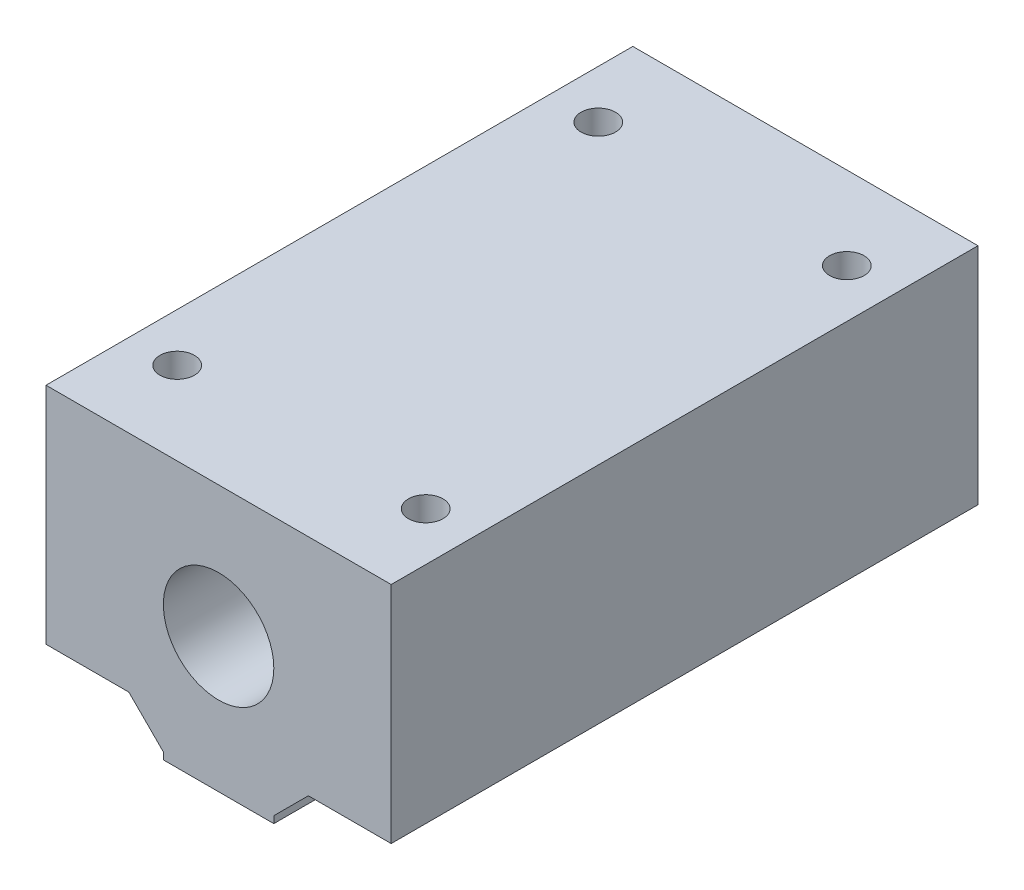
ISO-10303-21;
HEADER;
FILE_DESCRIPTION(('STEP AP214'),'2;1');
FILE_NAME('part.step','',(''),(''),'','','');
FILE_SCHEMA(('AUTOMOTIVE_DESIGN { 1 0 10303 214 1 1 1 1 }'));
ENDSEC;
DATA;
#1=APPLICATION_CONTEXT('core data for automotive mechanical design processes');
#2=APPLICATION_PROTOCOL_DEFINITION('international standard','automotive_design',2000,#1);
#3=PRODUCT_CONTEXT('',#1,'mechanical');
#4=PRODUCT('Part','Part','',(#3));
#5=PRODUCT_RELATED_PRODUCT_CATEGORY('part','',(#4));
#6=PRODUCT_DEFINITION_FORMATION('','',#4);
#7=PRODUCT_DEFINITION_CONTEXT('part definition',#1,'design');
#8=PRODUCT_DEFINITION('design','',#6,#7);
#9=PRODUCT_DEFINITION_SHAPE('','',#8);
#10=(LENGTH_UNIT() NAMED_UNIT(*) SI_UNIT(.MILLI.,.METRE.));
#11=(NAMED_UNIT(*) PLANE_ANGLE_UNIT() SI_UNIT($,.RADIAN.));
#12=(NAMED_UNIT(*) SI_UNIT($,.STERADIAN.) SOLID_ANGLE_UNIT());
#13=UNCERTAINTY_MEASURE_WITH_UNIT(LENGTH_MEASURE(1.E-05),#10,'distance_accuracy_value','');
#14=(GEOMETRIC_REPRESENTATION_CONTEXT(3) GLOBAL_UNCERTAINTY_ASSIGNED_CONTEXT((#13)) GLOBAL_UNIT_ASSIGNED_CONTEXT((#10,
#11,#12)) REPRESENTATION_CONTEXT('',''));
#15=CARTESIAN_POINT('',(0.,0.,0.));
#16=DIRECTION('',(0.,0.,1.));
#17=DIRECTION('',(1.,0.,0.));
#18=AXIS2_PLACEMENT_3D('',#15,#16,#17);
#19=CARTESIAN_POINT('',(-8.,5.99999999999999,85.));
#20=DIRECTION('',(0.,0.,1.));
#21=DIRECTION('',(1.,0.,0.));
#22=AXIS2_PLACEMENT_3D('',#19,#20,#21);
#23=PLANE('',#22);
#24=DIRECTION('',(0.,-1.,0.));
#25=VECTOR('',#24,1.);
#26=CARTESIAN_POINT('',(-8.,0.,85.));
#27=LINE('',#26,#25);
#28=CARTESIAN_POINT('',(-8.,0.999999999999986,85.));
#29=VERTEX_POINT('',#28);
#30=CARTESIAN_POINT('',(-8.,0.,85.));
#31=VERTEX_POINT('',#30);
#32=EDGE_CURVE('E162',#29,#31,#27,.T.);
#33=ORIENTED_EDGE('',*,*,#32,.T.);
#34=DIRECTION('',(1.,0.,0.));
#35=VECTOR('',#34,1.);
#36=CARTESIAN_POINT('',(8.,0.,85.));
#37=LINE('',#36,#35);
#38=CARTESIAN_POINT('',(8.,0.,85.));
#39=VERTEX_POINT('',#38);
#40=EDGE_CURVE('E100',#31,#39,#37,.T.);
#41=ORIENTED_EDGE('',*,*,#40,.T.);
#42=DIRECTION('',(0.,1.,0.));
#43=VECTOR('',#42,1.);
#44=CARTESIAN_POINT('',(8.,0.,85.));
#45=LINE('',#44,#43);
#46=CARTESIAN_POINT('',(8.,0.999999999999986,85.));
#47=VERTEX_POINT('',#46);
#48=EDGE_CURVE('E201',#39,#47,#45,.T.);
#49=ORIENTED_EDGE('',*,*,#48,.T.);
#50=DIRECTION('',(0.707106781186548,0.707106781186547,0.));
#51=VECTOR('',#50,1.);
#52=CARTESIAN_POINT('',(8.,0.999999999999986,85.));
#53=LINE('',#52,#51);
#54=CARTESIAN_POINT('',(13.,5.99999999999999,85.));
#55=VERTEX_POINT('',#54);
#56=EDGE_CURVE('E203',#47,#55,#53,.T.);
#57=ORIENTED_EDGE('',*,*,#56,.T.);
#58=DIRECTION('',(1.,0.,0.));
#59=VECTOR('',#58,1.);
#60=CARTESIAN_POINT('',(13.,5.99999999999999,85.));
#61=LINE('',#60,#59);
#62=CARTESIAN_POINT('',(25.,5.99999999999998,85.));
#63=VERTEX_POINT('',#62);
#64=EDGE_CURVE('E205',#55,#63,#61,.T.);
#65=ORIENTED_EDGE('',*,*,#64,.T.);
#66=DIRECTION('',(0.,1.,0.));
#67=VECTOR('',#66,1.);
#68=CARTESIAN_POINT('',(25.,5.99999999999998,85.));
#69=LINE('',#68,#67);
#70=CARTESIAN_POINT('',(25.,38.5,85.));
#71=VERTEX_POINT('',#70);
#72=EDGE_CURVE('E207',#63,#71,#69,.T.);
#73=ORIENTED_EDGE('',*,*,#72,.T.);
#74=DIRECTION('',(-1.,0.,0.));
#75=VECTOR('',#74,1.);
#76=CARTESIAN_POINT('',(-25.,38.5,85.));
#77=LINE('',#76,#75);
#78=CARTESIAN_POINT('',(-25.,38.5,85.));
#79=VERTEX_POINT('',#78);
#80=EDGE_CURVE('E125',#71,#79,#77,.T.);
#81=ORIENTED_EDGE('',*,*,#80,.T.);
#82=DIRECTION('',(0.,-1.,0.));
#83=VECTOR('',#82,1.);
#84=CARTESIAN_POINT('',(-25.,5.99999999999998,85.));
#85=LINE('',#84,#83);
#86=CARTESIAN_POINT('',(-25.,5.99999999999998,85.));
#87=VERTEX_POINT('',#86);
#88=EDGE_CURVE('E119',#79,#87,#85,.T.);
#89=ORIENTED_EDGE('',*,*,#88,.T.);
#90=DIRECTION('',(1.,0.,0.));
#91=VECTOR('',#90,1.);
#92=CARTESIAN_POINT('',(-13.,5.99999999999999,85.));
#93=LINE('',#92,#91);
#94=CARTESIAN_POINT('',(-13.,5.99999999999999,85.));
#95=VERTEX_POINT('',#94);
#96=EDGE_CURVE('E123',#87,#95,#93,.T.);
#97=ORIENTED_EDGE('',*,*,#96,.T.);
#98=DIRECTION('',(0.707106781186548,-0.707106781186547,0.));
#99=VECTOR('',#98,1.);
#100=CARTESIAN_POINT('',(-8.,0.999999999999986,85.));
#101=LINE('',#100,#99);
#102=EDGE_CURVE('E51',#95,#29,#101,.T.);
#103=ORIENTED_EDGE('',*,*,#102,.T.);
#104=EDGE_LOOP('',(#33,#41,#49,#57,#65,#73,#81,#89,#97,#103));
#105=FACE_BOUND('',#104,.T.);
#106=CARTESIAN_POINT('',(0.,19.5,85.));
#107=DIRECTION('',(0.,0.,1.));
#108=DIRECTION('',(1.,0.,0.));
#109=AXIS2_PLACEMENT_3D('',#106,#107,#108);
#110=CIRCLE('',#109,8.);
#111=CARTESIAN_POINT('',(8.,19.5,85.));
#112=VERTEX_POINT('',#111);
#113=EDGE_CURVE('E147',#112,#112,#110,.T.);
#114=ORIENTED_EDGE('',*,*,#113,.F.);
#115=EDGE_LOOP('',(#114));
#116=FACE_BOUND('',#115,.T.);
#117=ADVANCED_FACE('F32',(#105,#116),#23,.T.);
#118=CARTESIAN_POINT('',(-8.,5.99999999999999,0.));
#119=DIRECTION('',(0.,0.,1.));
#120=DIRECTION('',(1.,0.,0.));
#121=AXIS2_PLACEMENT_3D('',#118,#119,#120);
#122=PLANE('',#121);
#123=DIRECTION('',(0.,-1.,0.));
#124=VECTOR('',#123,1.);
#125=CARTESIAN_POINT('',(-8.,0.,0.));
#126=LINE('',#125,#124);
#127=CARTESIAN_POINT('',(-8.,0.999999999999986,0.));
#128=VERTEX_POINT('',#127);
#129=CARTESIAN_POINT('',(-8.,0.,0.));
#130=VERTEX_POINT('',#129);
#131=EDGE_CURVE('E143',#128,#130,#126,.T.);
#132=ORIENTED_EDGE('',*,*,#131,.F.);
#133=DIRECTION('',(0.707106781186548,-0.707106781186547,0.));
#134=VECTOR('',#133,1.);
#135=CARTESIAN_POINT('',(-8.,0.999999999999986,0.));
#136=LINE('',#135,#134);
#137=CARTESIAN_POINT('',(-13.,5.99999999999999,0.));
#138=VERTEX_POINT('',#137);
#139=EDGE_CURVE('E92',#138,#128,#136,.T.);
#140=ORIENTED_EDGE('',*,*,#139,.F.);
#141=DIRECTION('',(1.,0.,0.));
#142=VECTOR('',#141,1.);
#143=CARTESIAN_POINT('',(-13.,5.99999999999999,0.));
#144=LINE('',#143,#142);
#145=CARTESIAN_POINT('',(-25.,5.99999999999998,0.));
#146=VERTEX_POINT('',#145);
#147=EDGE_CURVE('E86',#146,#138,#144,.T.);
#148=ORIENTED_EDGE('',*,*,#147,.F.);
#149=DIRECTION('',(0.,-1.,0.));
#150=VECTOR('',#149,1.);
#151=CARTESIAN_POINT('',(-25.,5.99999999999998,0.));
#152=LINE('',#151,#150);
#153=CARTESIAN_POINT('',(-25.,38.5,0.));
#154=VERTEX_POINT('',#153);
#155=EDGE_CURVE('E133',#154,#146,#152,.T.);
#156=ORIENTED_EDGE('',*,*,#155,.F.);
#157=DIRECTION('',(-1.,0.,0.));
#158=VECTOR('',#157,1.);
#159=CARTESIAN_POINT('',(-25.,38.5,0.));
#160=LINE('',#159,#158);
#161=CARTESIAN_POINT('',(25.,38.5,0.));
#162=VERTEX_POINT('',#161);
#163=EDGE_CURVE('E157',#162,#154,#160,.T.);
#164=ORIENTED_EDGE('',*,*,#163,.F.);
#165=DIRECTION('',(0.,1.,0.));
#166=VECTOR('',#165,1.);
#167=CARTESIAN_POINT('',(25.,5.99999999999998,0.));
#168=LINE('',#167,#166);
#169=CARTESIAN_POINT('',(25.,5.99999999999998,0.));
#170=VERTEX_POINT('',#169);
#171=EDGE_CURVE('E155',#170,#162,#168,.T.);
#172=ORIENTED_EDGE('',*,*,#171,.F.);
#173=DIRECTION('',(1.,0.,0.));
#174=VECTOR('',#173,1.);
#175=CARTESIAN_POINT('',(13.,5.99999999999999,0.));
#176=LINE('',#175,#174);
#177=CARTESIAN_POINT('',(13.,5.99999999999999,0.));
#178=VERTEX_POINT('',#177);
#179=EDGE_CURVE('E153',#178,#170,#176,.T.);
#180=ORIENTED_EDGE('',*,*,#179,.F.);
#181=DIRECTION('',(0.707106781186548,0.707106781186547,0.));
#182=VECTOR('',#181,1.);
#183=CARTESIAN_POINT('',(8.,0.999999999999986,0.));
#184=LINE('',#183,#182);
#185=CARTESIAN_POINT('',(8.,0.999999999999986,0.));
#186=VERTEX_POINT('',#185);
#187=EDGE_CURVE('E151',#186,#178,#184,.T.);
#188=ORIENTED_EDGE('',*,*,#187,.F.);
#189=DIRECTION('',(0.,1.,0.));
#190=VECTOR('',#189,1.);
#191=CARTESIAN_POINT('',(8.,0.,0.));
#192=LINE('',#191,#190);
#193=CARTESIAN_POINT('',(8.,0.,0.));
#194=VERTEX_POINT('',#193);
#195=EDGE_CURVE('E149',#194,#186,#192,.T.);
#196=ORIENTED_EDGE('',*,*,#195,.F.);
#197=DIRECTION('',(1.,0.,0.));
#198=VECTOR('',#197,1.);
#199=CARTESIAN_POINT('',(8.,0.,0.));
#200=LINE('',#199,#198);
#201=EDGE_CURVE('E146',#130,#194,#200,.T.);
#202=ORIENTED_EDGE('',*,*,#201,.F.);
#203=EDGE_LOOP('',(#132,#140,#148,#156,#164,#172,#180,#188,#196,#202));
#204=FACE_BOUND('',#203,.T.);
#205=CARTESIAN_POINT('',(0.,19.5,0.));
#206=DIRECTION('',(0.,0.,1.));
#207=DIRECTION('',(1.,0.,0.));
#208=AXIS2_PLACEMENT_3D('',#205,#206,#207);
#209=CIRCLE('',#208,8.);
#210=CARTESIAN_POINT('',(8.,19.5,0.));
#211=VERTEX_POINT('',#210);
#212=EDGE_CURVE('E181',#211,#211,#209,.T.);
#213=ORIENTED_EDGE('',*,*,#212,.T.);
#214=EDGE_LOOP('',(#213));
#215=FACE_BOUND('',#214,.T.);
#216=ADVANCED_FACE('F220',(#204,#215),#122,.F.);
#217=CARTESIAN_POINT('',(-8.,0.,85.));
#218=DIRECTION('',(1.,0.,0.));
#219=DIRECTION('',(0.,0.,-1.));
#220=AXIS2_PLACEMENT_3D('',#217,#218,#219);
#221=PLANE('',#220);
#222=ORIENTED_EDGE('',*,*,#131,.T.);
#223=DIRECTION('',(0.,0.,-1.));
#224=VECTOR('',#223,1.);
#225=CARTESIAN_POINT('',(-8.,0.,85.));
#226=LINE('',#225,#224);
#227=EDGE_CURVE('E11',#31,#130,#226,.T.);
#228=ORIENTED_EDGE('',*,*,#227,.F.);
#229=ORIENTED_EDGE('',*,*,#32,.F.);
#230=DIRECTION('',(0.,0.,-1.));
#231=VECTOR('',#230,1.);
#232=CARTESIAN_POINT('',(-8.,0.999999999999986,85.));
#233=LINE('',#232,#231);
#234=EDGE_CURVE('E139',#29,#128,#233,.T.);
#235=ORIENTED_EDGE('',*,*,#234,.T.);
#236=EDGE_LOOP('',(#222,#228,#229,#235));
#237=FACE_BOUND('',#236,.T.);
#238=ADVANCED_FACE('F34',(#237),#221,.F.);
#239=CARTESIAN_POINT('',(8.,0.,85.));
#240=DIRECTION('',(0.,1.,0.));
#241=DIRECTION('',(0.,0.,1.));
#242=AXIS2_PLACEMENT_3D('',#239,#240,#241);
#243=PLANE('',#242);
#244=ORIENTED_EDGE('',*,*,#201,.T.);
#245=DIRECTION('',(0.,0.,-1.));
#246=VECTOR('',#245,1.);
#247=CARTESIAN_POINT('',(8.,0.,85.));
#248=LINE('',#247,#246);
#249=EDGE_CURVE('E42',#39,#194,#248,.T.);
#250=ORIENTED_EDGE('',*,*,#249,.F.);
#251=ORIENTED_EDGE('',*,*,#40,.F.);
#252=ORIENTED_EDGE('',*,*,#227,.T.);
#253=EDGE_LOOP('',(#244,#250,#251,#252));
#254=FACE_BOUND('',#253,.T.);
#255=ADVANCED_FACE('F300',(#254),#243,.F.);
#256=CARTESIAN_POINT('',(8.,0.,85.));
#257=DIRECTION('',(-1.,0.,0.));
#258=DIRECTION('',(0.,0.,1.));
#259=AXIS2_PLACEMENT_3D('',#256,#257,#258);
#260=PLANE('',#259);
#261=ORIENTED_EDGE('',*,*,#195,.T.);
#262=DIRECTION('',(0.,0.,-1.));
#263=VECTOR('',#262,1.);
#264=CARTESIAN_POINT('',(8.,0.999999999999986,85.));
#265=LINE('',#264,#263);
#266=EDGE_CURVE('E175',#47,#186,#265,.T.);
#267=ORIENTED_EDGE('',*,*,#266,.F.);
#268=ORIENTED_EDGE('',*,*,#48,.F.);
#269=ORIENTED_EDGE('',*,*,#249,.T.);
#270=EDGE_LOOP('',(#261,#267,#268,#269));
#271=FACE_BOUND('',#270,.T.);
#272=ADVANCED_FACE('F297',(#271),#260,.F.);
#273=CARTESIAN_POINT('',(8.,0.999999999999986,85.));
#274=DIRECTION('',(-0.707106781186547,0.707106781186548,0.));
#275=DIRECTION('',(-0.707106781186548,-0.707106781186547,0.));
#276=AXIS2_PLACEMENT_3D('',#273,#274,#275);
#277=PLANE('',#276);
#278=ORIENTED_EDGE('',*,*,#187,.T.);
#279=DIRECTION('',(0.,0.,-1.));
#280=VECTOR('',#279,1.);
#281=CARTESIAN_POINT('',(13.,5.99999999999999,85.));
#282=LINE('',#281,#280);
#283=EDGE_CURVE('E172',#55,#178,#282,.T.);
#284=ORIENTED_EDGE('',*,*,#283,.F.);
#285=ORIENTED_EDGE('',*,*,#56,.F.);
#286=ORIENTED_EDGE('',*,*,#266,.T.);
#287=EDGE_LOOP('',(#278,#284,#285,#286));
#288=FACE_BOUND('',#287,.T.);
#289=ADVANCED_FACE('F293',(#288),#277,.F.);
#290=CARTESIAN_POINT('',(13.,5.99999999999999,85.));
#291=DIRECTION('',(0.,1.,0.));
#292=DIRECTION('',(-1.,0.,0.));
#293=AXIS2_PLACEMENT_3D('',#290,#291,#292);
#294=PLANE('',#293);
#295=CARTESIAN_POINT('',(18.,5.99999999999999,73.));
#296=DIRECTION('',(0.,1.,0.));
#297=DIRECTION('',(-1.,0.,0.));
#298=AXIS2_PLACEMENT_3D('',#295,#296,#297);
#299=CIRCLE('',#298,2.5);
#300=CARTESIAN_POINT('',(18.,5.99999999999999,75.5));
#301=VERTEX_POINT('',#300);
#302=EDGE_CURVE('E269',#301,#301,#299,.T.);
#303=ORIENTED_EDGE('',*,*,#302,.T.);
#304=EDGE_LOOP('',(#303));
#305=FACE_BOUND('',#304,.T.);
#306=CARTESIAN_POINT('',(18.,5.99999999999999,12.));
#307=DIRECTION('',(0.,1.,0.));
#308=DIRECTION('',(-1.,0.,0.));
#309=AXIS2_PLACEMENT_3D('',#306,#307,#308);
#310=CIRCLE('',#309,2.5);
#311=CARTESIAN_POINT('',(18.,5.99999999999999,14.5));
#312=VERTEX_POINT('',#311);
#313=EDGE_CURVE('E188',#312,#312,#310,.T.);
#314=ORIENTED_EDGE('',*,*,#313,.T.);
#315=EDGE_LOOP('',(#314));
#316=FACE_BOUND('',#315,.T.);
#317=ORIENTED_EDGE('',*,*,#179,.T.);
#318=DIRECTION('',(0.,0.,-1.));
#319=VECTOR('',#318,1.);
#320=CARTESIAN_POINT('',(25.,5.99999999999998,85.));
#321=LINE('',#320,#319);
#322=EDGE_CURVE('E169',#63,#170,#321,.T.);
#323=ORIENTED_EDGE('',*,*,#322,.F.);
#324=ORIENTED_EDGE('',*,*,#64,.F.);
#325=ORIENTED_EDGE('',*,*,#283,.T.);
#326=EDGE_LOOP('',(#317,#323,#324,#325));
#327=FACE_BOUND('',#326,.T.);
#328=ADVANCED_FACE('F287',(#305,#316,#327),#294,.F.);
#329=CARTESIAN_POINT('',(25.,5.99999999999998,85.));
#330=DIRECTION('',(-1.,0.,0.));
#331=DIRECTION('',(0.,0.,1.));
#332=AXIS2_PLACEMENT_3D('',#329,#330,#331);
#333=PLANE('',#332);
#334=ORIENTED_EDGE('',*,*,#171,.T.);
#335=DIRECTION('',(0.,0.,-1.));
#336=VECTOR('',#335,1.);
#337=CARTESIAN_POINT('',(25.,38.5,85.));
#338=LINE('',#337,#336);
#339=EDGE_CURVE('E166',#71,#162,#338,.T.);
#340=ORIENTED_EDGE('',*,*,#339,.F.);
#341=ORIENTED_EDGE('',*,*,#72,.F.);
#342=ORIENTED_EDGE('',*,*,#322,.T.);
#343=EDGE_LOOP('',(#334,#340,#341,#342));
#344=FACE_BOUND('',#343,.T.);
#345=ADVANCED_FACE('F213',(#344),#333,.F.);
#346=CARTESIAN_POINT('',(-25.,38.5,85.));
#347=DIRECTION('',(0.,-1.,0.));
#348=DIRECTION('',(0.,0.,-1.));
#349=AXIS2_PLACEMENT_3D('',#346,#347,#348);
#350=PLANE('',#349);
#351=CARTESIAN_POINT('',(-18.,38.5,73.));
#352=DIRECTION('',(0.,1.,0.));
#353=DIRECTION('',(0.,0.,-1.));
#354=AXIS2_PLACEMENT_3D('',#351,#352,#353);
#355=CIRCLE('',#354,2.5);
#356=CARTESIAN_POINT('',(-18.,38.5,75.5));
#357=VERTEX_POINT('',#356);
#358=EDGE_CURVE('E264',#357,#357,#355,.T.);
#359=ORIENTED_EDGE('',*,*,#358,.F.);
#360=EDGE_LOOP('',(#359));
#361=FACE_BOUND('',#360,.T.);
#362=CARTESIAN_POINT('',(18.,38.5,73.));
#363=DIRECTION('',(0.,1.,0.));
#364=DIRECTION('',(0.,0.,1.));
#365=AXIS2_PLACEMENT_3D('',#362,#363,#364);
#366=CIRCLE('',#365,2.5);
#367=CARTESIAN_POINT('',(18.,38.5,75.5));
#368=VERTEX_POINT('',#367);
#369=EDGE_CURVE('E267',#368,#368,#366,.T.);
#370=ORIENTED_EDGE('',*,*,#369,.F.);
#371=EDGE_LOOP('',(#370));
#372=FACE_BOUND('',#371,.T.);
#373=CARTESIAN_POINT('',(18.,38.5,12.));
#374=DIRECTION('',(0.,1.,0.));
#375=DIRECTION('',(0.,0.,-1.));
#376=AXIS2_PLACEMENT_3D('',#373,#374,#375);
#377=CIRCLE('',#376,2.5);
#378=CARTESIAN_POINT('',(18.,38.5,14.5));
#379=VERTEX_POINT('',#378);
#380=EDGE_CURVE('E193',#379,#379,#377,.T.);
#381=ORIENTED_EDGE('',*,*,#380,.F.);
#382=EDGE_LOOP('',(#381));
#383=FACE_BOUND('',#382,.T.);
#384=CARTESIAN_POINT('',(-18.,38.5,12.));
#385=DIRECTION('',(0.,1.,0.));
#386=DIRECTION('',(0.,0.,1.));
#387=AXIS2_PLACEMENT_3D('',#384,#385,#386);
#388=CIRCLE('',#387,2.5);
#389=CARTESIAN_POINT('',(-18.,38.5,14.5));
#390=VERTEX_POINT('',#389);
#391=EDGE_CURVE('E182',#390,#390,#388,.T.);
#392=ORIENTED_EDGE('',*,*,#391,.F.);
#393=EDGE_LOOP('',(#392));
#394=FACE_BOUND('',#393,.T.);
#395=ORIENTED_EDGE('',*,*,#163,.T.);
#396=DIRECTION('',(0.,0.,-1.));
#397=VECTOR('',#396,1.);
#398=CARTESIAN_POINT('',(-25.,38.5,85.));
#399=LINE('',#398,#397);
#400=EDGE_CURVE('E134',#79,#154,#399,.T.);
#401=ORIENTED_EDGE('',*,*,#400,.F.);
#402=ORIENTED_EDGE('',*,*,#80,.F.);
#403=ORIENTED_EDGE('',*,*,#339,.T.);
#404=EDGE_LOOP('',(#395,#401,#402,#403));
#405=FACE_BOUND('',#404,.T.);
#406=ADVANCED_FACE('F217',(#361,#372,#383,#394,#405),#350,.F.);
#407=CARTESIAN_POINT('',(-25.,5.99999999999998,85.));
#408=DIRECTION('',(1.,0.,0.));
#409=DIRECTION('',(0.,0.,-1.));
#410=AXIS2_PLACEMENT_3D('',#407,#408,#409);
#411=PLANE('',#410);
#412=ORIENTED_EDGE('',*,*,#155,.T.);
#413=DIRECTION('',(0.,0.,-1.));
#414=VECTOR('',#413,1.);
#415=CARTESIAN_POINT('',(-25.,5.99999999999998,85.));
#416=LINE('',#415,#414);
#417=EDGE_CURVE('E130',#87,#146,#416,.T.);
#418=ORIENTED_EDGE('',*,*,#417,.F.);
#419=ORIENTED_EDGE('',*,*,#88,.F.);
#420=ORIENTED_EDGE('',*,*,#400,.T.);
#421=EDGE_LOOP('',(#412,#418,#419,#420));
#422=FACE_BOUND('',#421,.T.);
#423=ADVANCED_FACE('F131',(#422),#411,.F.);
#424=CARTESIAN_POINT('',(-13.,5.99999999999999,85.));
#425=DIRECTION('',(0.,1.,0.));
#426=DIRECTION('',(-1.,0.,0.));
#427=AXIS2_PLACEMENT_3D('',#424,#425,#426);
#428=PLANE('',#427);
#429=CARTESIAN_POINT('',(-18.,5.99999999999999,73.));
#430=DIRECTION('',(0.,1.,0.));
#431=DIRECTION('',(-1.,0.,0.));
#432=AXIS2_PLACEMENT_3D('',#429,#430,#431);
#433=CIRCLE('',#432,2.5);
#434=CARTESIAN_POINT('',(-18.,5.99999999999999,75.5));
#435=VERTEX_POINT('',#434);
#436=EDGE_CURVE('E36',#435,#435,#433,.T.);
#437=ORIENTED_EDGE('',*,*,#436,.T.);
#438=EDGE_LOOP('',(#437));
#439=FACE_BOUND('',#438,.T.);
#440=CARTESIAN_POINT('',(-18.,5.99999999999999,12.));
#441=DIRECTION('',(0.,1.,0.));
#442=DIRECTION('',(-1.,0.,0.));
#443=AXIS2_PLACEMENT_3D('',#440,#441,#442);
#444=CIRCLE('',#443,2.5);
#445=CARTESIAN_POINT('',(-18.,5.99999999999999,14.5));
#446=VERTEX_POINT('',#445);
#447=EDGE_CURVE('E179',#446,#446,#444,.T.);
#448=ORIENTED_EDGE('',*,*,#447,.T.);
#449=EDGE_LOOP('',(#448));
#450=FACE_BOUND('',#449,.T.);
#451=ORIENTED_EDGE('',*,*,#147,.T.);
#452=DIRECTION('',(0.,0.,-1.));
#453=VECTOR('',#452,1.);
#454=CARTESIAN_POINT('',(-13.,5.99999999999999,85.));
#455=LINE('',#454,#453);
#456=EDGE_CURVE('E135',#95,#138,#455,.T.);
#457=ORIENTED_EDGE('',*,*,#456,.F.);
#458=ORIENTED_EDGE('',*,*,#96,.F.);
#459=ORIENTED_EDGE('',*,*,#417,.T.);
#460=EDGE_LOOP('',(#451,#457,#458,#459));
#461=FACE_BOUND('',#460,.T.);
#462=ADVANCED_FACE('F137',(#439,#450,#461),#428,.F.);
#463=CARTESIAN_POINT('',(-8.,0.999999999999986,85.));
#464=DIRECTION('',(0.707106781186547,0.707106781186548,0.));
#465=DIRECTION('',(-0.707106781186548,0.707106781186547,0.));
#466=AXIS2_PLACEMENT_3D('',#463,#464,#465);
#467=PLANE('',#466);
#468=ORIENTED_EDGE('',*,*,#139,.T.);
#469=ORIENTED_EDGE('',*,*,#234,.F.);
#470=ORIENTED_EDGE('',*,*,#102,.F.);
#471=ORIENTED_EDGE('',*,*,#456,.T.);
#472=EDGE_LOOP('',(#468,#469,#470,#471));
#473=FACE_BOUND('',#472,.T.);
#474=ADVANCED_FACE('F226',(#473),#467,.F.);
#475=CARTESIAN_POINT('',(0.,19.5,85.));
#476=DIRECTION('',(0.,0.,-1.));
#477=DIRECTION('',(-1.,0.,0.));
#478=AXIS2_PLACEMENT_3D('',#475,#476,#477);
#479=CYLINDRICAL_SURFACE('',#478,8.);
#480=ORIENTED_EDGE('',*,*,#113,.T.);
#481=EDGE_LOOP('',(#480));
#482=FACE_BOUND('',#481,.T.);
#483=ORIENTED_EDGE('',*,*,#212,.F.);
#484=EDGE_LOOP('',(#483));
#485=FACE_BOUND('',#484,.T.);
#486=ADVANCED_FACE('F228',(#482,#485),#479,.F.);
#487=CARTESIAN_POINT('',(-18.,0.,12.));
#488=DIRECTION('',(0.,1.,0.));
#489=DIRECTION('',(0.,0.,1.));
#490=AXIS2_PLACEMENT_3D('',#487,#488,#489);
#491=CYLINDRICAL_SURFACE('',#490,2.5);
#492=CARTESIAN_POINT('',(-18.,38.5,14.5));
#493=CARTESIAN_POINT('',(-18.,38.1614583333333,14.5));
#494=CARTESIAN_POINT('',(-18.,37.8229166666666,14.5));
#495=CARTESIAN_POINT('',(-18.,37.1458333333333,14.5));
#496=CARTESIAN_POINT('',(-18.,36.8072916666666,14.5));
#497=CARTESIAN_POINT('',(-18.,36.1302083333333,14.5));
#498=CARTESIAN_POINT('',(-18.,35.7916666666666,14.5));
#499=CARTESIAN_POINT('',(-18.,35.1145833333333,14.5));
#500=CARTESIAN_POINT('',(-18.,34.7760416666666,14.5));
#501=CARTESIAN_POINT('',(-18.,34.0989583333333,14.5));
#502=CARTESIAN_POINT('',(-18.,33.7604166666667,14.5));
#503=CARTESIAN_POINT('',(-18.,33.0833333333333,14.5));
#504=CARTESIAN_POINT('',(-18.,32.7447916666666,14.5));
#505=CARTESIAN_POINT('',(-18.,32.0677083333333,14.5));
#506=CARTESIAN_POINT('',(-18.,31.7291666666666,14.5));
#507=CARTESIAN_POINT('',(-18.,31.0520833333333,14.5));
#508=CARTESIAN_POINT('',(-18.,30.7135416666666,14.5));
#509=CARTESIAN_POINT('',(-18.,30.0364583333333,14.5));
#510=CARTESIAN_POINT('',(-18.,29.6979166666667,14.5));
#511=CARTESIAN_POINT('',(-18.,29.0208333333333,14.5));
#512=CARTESIAN_POINT('',(-18.,28.6822916666667,14.5));
#513=CARTESIAN_POINT('',(-18.,28.0052083333333,14.5));
#514=CARTESIAN_POINT('',(-18.,27.6666666666667,14.5));
#515=CARTESIAN_POINT('',(-18.,26.9895833333333,14.5));
#516=CARTESIAN_POINT('',(-18.,26.6510416666667,14.5));
#517=CARTESIAN_POINT('',(-18.,25.9739583333333,14.5));
#518=CARTESIAN_POINT('',(-18.,25.6354166666667,14.5));
#519=CARTESIAN_POINT('',(-18.,24.9583333333333,14.5));
#520=CARTESIAN_POINT('',(-18.,24.6197916666666,14.5));
#521=CARTESIAN_POINT('',(-18.,23.9427083333333,14.5));
#522=CARTESIAN_POINT('',(-18.,23.6041666666667,14.5));
#523=CARTESIAN_POINT('',(-18.,22.9270833333333,14.5));
#524=CARTESIAN_POINT('',(-18.,22.5885416666667,14.5));
#525=CARTESIAN_POINT('',(-18.,21.9114583333333,14.5));
#526=CARTESIAN_POINT('',(-18.,21.5729166666667,14.5));
#527=CARTESIAN_POINT('',(-18.,20.8958333333333,14.5));
#528=CARTESIAN_POINT('',(-18.,20.5572916666667,14.5));
#529=CARTESIAN_POINT('',(-18.,19.8802083333333,14.5));
#530=CARTESIAN_POINT('',(-18.,19.5416666666666,14.5));
#531=CARTESIAN_POINT('',(-18.,18.8645833333333,14.5));
#532=CARTESIAN_POINT('',(-18.,18.5260416666667,14.5));
#533=CARTESIAN_POINT('',(-18.,17.8489583333333,14.5));
#534=CARTESIAN_POINT('',(-18.,17.5104166666667,14.5));
#535=CARTESIAN_POINT('',(-18.,16.8333333333333,14.5));
#536=CARTESIAN_POINT('',(-18.,16.4947916666666,14.5));
#537=CARTESIAN_POINT('',(-18.,15.8177083333333,14.5));
#538=CARTESIAN_POINT('',(-18.,15.4791666666666,14.5));
#539=CARTESIAN_POINT('',(-18.,14.8020833333333,14.5));
#540=CARTESIAN_POINT('',(-18.,14.4635416666666,14.5));
#541=CARTESIAN_POINT('',(-18.,13.7864583333333,14.5));
#542=CARTESIAN_POINT('',(-18.,13.4479166666667,14.5));
#543=CARTESIAN_POINT('',(-18.,12.7708333333333,14.5));
#544=CARTESIAN_POINT('',(-18.,12.4322916666667,14.5));
#545=CARTESIAN_POINT('',(-18.,11.7552083333333,14.5));
#546=CARTESIAN_POINT('',(-18.,11.4166666666667,14.5));
#547=CARTESIAN_POINT('',(-18.,10.7395833333333,14.5));
#548=CARTESIAN_POINT('',(-18.,10.4010416666666,14.5));
#549=CARTESIAN_POINT('',(-18.,9.72395833333332,14.5));
#550=CARTESIAN_POINT('',(-18.,9.38541666666665,14.5));
#551=CARTESIAN_POINT('',(-18.,8.70833333333332,14.5));
#552=CARTESIAN_POINT('',(-18.,8.36979166666665,14.5));
#553=CARTESIAN_POINT('',(-18.,7.69270833333332,14.5));
#554=CARTESIAN_POINT('',(-18.,7.35416666666665,14.5));
#555=CARTESIAN_POINT('',(-18.,6.67708333333332,14.5));
#556=CARTESIAN_POINT('',(-18.,6.33854166666665,14.5));
#557=CARTESIAN_POINT('',(-18.,5.99999999999998,14.5));
#558=B_SPLINE_CURVE_WITH_KNOTS('',3,(#492,#493,#494,#495,#496,#497,#498,#499,#500,#501,#502,
#503,#504,#505,#506,#507,#508,#509,#510,#511,#512,#513,#514,#515,#516,#517,#518,#519,#520,#521,
#522,#523,#524,#525,#526,#527,#528,#529,#530,#531,#532,#533,#534,#535,#536,#537,#538,#539,#540,
#541,#542,#543,#544,#545,#546,#547,#548,#549,#550,#551,#552,#553,#554,#555,#556,#557),
.UNSPECIFIED.,.F.,.F.,(4,2,2,2,2,2,2,2,2,2,2,2,2,2,2,2,2,2,2,2,2,2,2,2,2,2,2,2,2,2,2,2,4),(0.,
1.015625,2.03125,3.046875,4.0625,5.078125,6.09375,7.109375,8.125,9.140625,10.15625,11.171875,
12.1875,13.203125,14.21875,15.234375,16.25,17.265625,18.28125,19.296875,20.3125,21.328125,
22.34375,23.359375,24.375,25.390625,26.40625,27.421875,28.4375,29.453125,30.46875,31.484375,
32.5),.UNSPECIFIED.);
#559=EDGE_CURVE('BSEAM234',#390,#446,#558,.T.);
#560=ORIENTED_EDGE('',*,*,#391,.T.);
#561=ORIENTED_EDGE('',*,*,#447,.F.);
#562=ORIENTED_EDGE('',*,*,#559,.T.);
#563=ORIENTED_EDGE('',*,*,#559,.F.);
#564=EDGE_LOOP('',(#560,#562,#561,#563));
#565=FACE_BOUND('',#564,.T.);
#566=ADVANCED_FACE('F234',(#565),#491,.F.);
#567=CARTESIAN_POINT('',(18.,0.,12.));
#568=DIRECTION('',(0.,1.,0.));
#569=DIRECTION('',(0.,0.,1.));
#570=AXIS2_PLACEMENT_3D('',#567,#568,#569);
#571=CYLINDRICAL_SURFACE('',#570,2.5);
#572=CARTESIAN_POINT('',(18.,38.5,14.5));
#573=CARTESIAN_POINT('',(18.,38.1614583333333,14.5));
#574=CARTESIAN_POINT('',(18.,37.8229166666666,14.5));
#575=CARTESIAN_POINT('',(18.,37.1458333333333,14.5));
#576=CARTESIAN_POINT('',(18.,36.8072916666666,14.5));
#577=CARTESIAN_POINT('',(18.,36.1302083333333,14.5));
#578=CARTESIAN_POINT('',(18.,35.7916666666666,14.5));
#579=CARTESIAN_POINT('',(18.,35.1145833333333,14.5));
#580=CARTESIAN_POINT('',(18.,34.7760416666666,14.5));
#581=CARTESIAN_POINT('',(18.,34.0989583333333,14.5));
#582=CARTESIAN_POINT('',(18.,33.7604166666667,14.5));
#583=CARTESIAN_POINT('',(18.,33.0833333333333,14.5));
#584=CARTESIAN_POINT('',(18.,32.7447916666666,14.5));
#585=CARTESIAN_POINT('',(18.,32.0677083333333,14.5));
#586=CARTESIAN_POINT('',(18.,31.7291666666666,14.5));
#587=CARTESIAN_POINT('',(18.,31.0520833333333,14.5));
#588=CARTESIAN_POINT('',(18.,30.7135416666666,14.5));
#589=CARTESIAN_POINT('',(18.,30.0364583333333,14.5));
#590=CARTESIAN_POINT('',(18.,29.6979166666667,14.5));
#591=CARTESIAN_POINT('',(18.,29.0208333333333,14.5));
#592=CARTESIAN_POINT('',(18.,28.6822916666667,14.5));
#593=CARTESIAN_POINT('',(18.,28.0052083333333,14.5));
#594=CARTESIAN_POINT('',(18.,27.6666666666667,14.5));
#595=CARTESIAN_POINT('',(18.,26.9895833333333,14.5));
#596=CARTESIAN_POINT('',(18.,26.6510416666667,14.5));
#597=CARTESIAN_POINT('',(18.,25.9739583333333,14.5));
#598=CARTESIAN_POINT('',(18.,25.6354166666667,14.5));
#599=CARTESIAN_POINT('',(18.,24.9583333333333,14.5));
#600=CARTESIAN_POINT('',(18.,24.6197916666666,14.5));
#601=CARTESIAN_POINT('',(18.,23.9427083333333,14.5));
#602=CARTESIAN_POINT('',(18.,23.6041666666667,14.5));
#603=CARTESIAN_POINT('',(18.,22.9270833333333,14.5));
#604=CARTESIAN_POINT('',(18.,22.5885416666667,14.5));
#605=CARTESIAN_POINT('',(18.,21.9114583333333,14.5));
#606=CARTESIAN_POINT('',(18.,21.5729166666667,14.5));
#607=CARTESIAN_POINT('',(18.,20.8958333333333,14.5));
#608=CARTESIAN_POINT('',(18.,20.5572916666667,14.5));
#609=CARTESIAN_POINT('',(18.,19.8802083333333,14.5));
#610=CARTESIAN_POINT('',(18.,19.5416666666666,14.5));
#611=CARTESIAN_POINT('',(18.,18.8645833333333,14.5));
#612=CARTESIAN_POINT('',(18.,18.5260416666667,14.5));
#613=CARTESIAN_POINT('',(18.,17.8489583333333,14.5));
#614=CARTESIAN_POINT('',(18.,17.5104166666667,14.5));
#615=CARTESIAN_POINT('',(18.,16.8333333333333,14.5));
#616=CARTESIAN_POINT('',(18.,16.4947916666666,14.5));
#617=CARTESIAN_POINT('',(18.,15.8177083333333,14.5));
#618=CARTESIAN_POINT('',(18.,15.4791666666666,14.5));
#619=CARTESIAN_POINT('',(18.,14.8020833333333,14.5));
#620=CARTESIAN_POINT('',(18.,14.4635416666666,14.5));
#621=CARTESIAN_POINT('',(18.,13.7864583333333,14.5));
#622=CARTESIAN_POINT('',(18.,13.4479166666667,14.5));
#623=CARTESIAN_POINT('',(18.,12.7708333333333,14.5));
#624=CARTESIAN_POINT('',(18.,12.4322916666667,14.5));
#625=CARTESIAN_POINT('',(18.,11.7552083333333,14.5));
#626=CARTESIAN_POINT('',(18.,11.4166666666667,14.5));
#627=CARTESIAN_POINT('',(18.,10.7395833333333,14.5));
#628=CARTESIAN_POINT('',(18.,10.4010416666666,14.5));
#629=CARTESIAN_POINT('',(18.,9.72395833333332,14.5));
#630=CARTESIAN_POINT('',(18.,9.38541666666665,14.5));
#631=CARTESIAN_POINT('',(18.,8.70833333333332,14.5));
#632=CARTESIAN_POINT('',(18.,8.36979166666665,14.5));
#633=CARTESIAN_POINT('',(18.,7.69270833333332,14.5));
#634=CARTESIAN_POINT('',(18.,7.35416666666665,14.5));
#635=CARTESIAN_POINT('',(18.,6.67708333333332,14.5));
#636=CARTESIAN_POINT('',(18.,6.33854166666665,14.5));
#637=CARTESIAN_POINT('',(18.,5.99999999999998,14.5));
#638=B_SPLINE_CURVE_WITH_KNOTS('',3,(#572,#573,#574,#575,#576,#577,#578,#579,#580,#581,#582,
#583,#584,#585,#586,#587,#588,#589,#590,#591,#592,#593,#594,#595,#596,#597,#598,#599,#600,#601,
#602,#603,#604,#605,#606,#607,#608,#609,#610,#611,#612,#613,#614,#615,#616,#617,#618,#619,#620,
#621,#622,#623,#624,#625,#626,#627,#628,#629,#630,#631,#632,#633,#634,#635,#636,#637),
.UNSPECIFIED.,.F.,.F.,(4,2,2,2,2,2,2,2,2,2,2,2,2,2,2,2,2,2,2,2,2,2,2,2,2,2,2,2,2,2,2,2,4),(0.,
1.015625,2.03125,3.046875,4.0625,5.078125,6.09375,7.109375,8.125,9.140625,10.15625,11.171875,
12.1875,13.203125,14.21875,15.234375,16.25,17.265625,18.28125,19.296875,20.3125,21.328125,
22.34375,23.359375,24.375,25.390625,26.40625,27.421875,28.4375,29.453125,30.46875,31.484375,
32.5),.UNSPECIFIED.);
#639=EDGE_CURVE('BSEAM248',#379,#312,#638,.T.);
#640=ORIENTED_EDGE('',*,*,#380,.T.);
#641=ORIENTED_EDGE('',*,*,#313,.F.);
#642=ORIENTED_EDGE('',*,*,#639,.T.);
#643=ORIENTED_EDGE('',*,*,#639,.F.);
#644=EDGE_LOOP('',(#640,#642,#641,#643));
#645=FACE_BOUND('',#644,.T.);
#646=ADVANCED_FACE('F248',(#645),#571,.F.);
#647=CARTESIAN_POINT('',(18.,0.,73.));
#648=DIRECTION('',(0.,1.,0.));
#649=DIRECTION('',(0.,0.,1.));
#650=AXIS2_PLACEMENT_3D('',#647,#648,#649);
#651=CYLINDRICAL_SURFACE('',#650,2.5);
#652=CARTESIAN_POINT('',(18.,38.5,75.5));
#653=CARTESIAN_POINT('',(18.,38.1614583333333,75.5));
#654=CARTESIAN_POINT('',(18.,37.8229166666666,75.5));
#655=CARTESIAN_POINT('',(18.,37.1458333333333,75.5));
#656=CARTESIAN_POINT('',(18.,36.8072916666666,75.5));
#657=CARTESIAN_POINT('',(18.,36.1302083333333,75.5));
#658=CARTESIAN_POINT('',(18.,35.7916666666666,75.5));
#659=CARTESIAN_POINT('',(18.,35.1145833333333,75.5));
#660=CARTESIAN_POINT('',(18.,34.7760416666666,75.5));
#661=CARTESIAN_POINT('',(18.,34.0989583333333,75.5));
#662=CARTESIAN_POINT('',(18.,33.7604166666667,75.5));
#663=CARTESIAN_POINT('',(18.,33.0833333333333,75.5));
#664=CARTESIAN_POINT('',(18.,32.7447916666666,75.5));
#665=CARTESIAN_POINT('',(18.,32.0677083333333,75.5));
#666=CARTESIAN_POINT('',(18.,31.7291666666666,75.5));
#667=CARTESIAN_POINT('',(18.,31.0520833333333,75.5));
#668=CARTESIAN_POINT('',(18.,30.7135416666666,75.5));
#669=CARTESIAN_POINT('',(18.,30.0364583333333,75.5));
#670=CARTESIAN_POINT('',(18.,29.6979166666667,75.5));
#671=CARTESIAN_POINT('',(18.,29.0208333333333,75.5));
#672=CARTESIAN_POINT('',(18.,28.6822916666667,75.5));
#673=CARTESIAN_POINT('',(18.,28.0052083333333,75.5));
#674=CARTESIAN_POINT('',(18.,27.6666666666667,75.5));
#675=CARTESIAN_POINT('',(18.,26.9895833333333,75.5));
#676=CARTESIAN_POINT('',(18.,26.6510416666667,75.5));
#677=CARTESIAN_POINT('',(18.,25.9739583333333,75.5));
#678=CARTESIAN_POINT('',(18.,25.6354166666667,75.5));
#679=CARTESIAN_POINT('',(18.,24.9583333333333,75.5));
#680=CARTESIAN_POINT('',(18.,24.6197916666666,75.5));
#681=CARTESIAN_POINT('',(18.,23.9427083333333,75.5));
#682=CARTESIAN_POINT('',(18.,23.6041666666667,75.5));
#683=CARTESIAN_POINT('',(18.,22.9270833333333,75.5));
#684=CARTESIAN_POINT('',(18.,22.5885416666667,75.5));
#685=CARTESIAN_POINT('',(18.,21.9114583333333,75.5));
#686=CARTESIAN_POINT('',(18.,21.5729166666667,75.5));
#687=CARTESIAN_POINT('',(18.,20.8958333333333,75.5));
#688=CARTESIAN_POINT('',(18.,20.5572916666667,75.5));
#689=CARTESIAN_POINT('',(18.,19.8802083333333,75.5));
#690=CARTESIAN_POINT('',(18.,19.5416666666666,75.5));
#691=CARTESIAN_POINT('',(18.,18.8645833333333,75.5));
#692=CARTESIAN_POINT('',(18.,18.5260416666667,75.5));
#693=CARTESIAN_POINT('',(18.,17.8489583333333,75.5));
#694=CARTESIAN_POINT('',(18.,17.5104166666667,75.5));
#695=CARTESIAN_POINT('',(18.,16.8333333333333,75.5));
#696=CARTESIAN_POINT('',(18.,16.4947916666666,75.5));
#697=CARTESIAN_POINT('',(18.,15.8177083333333,75.5));
#698=CARTESIAN_POINT('',(18.,15.4791666666666,75.5));
#699=CARTESIAN_POINT('',(18.,14.8020833333333,75.5));
#700=CARTESIAN_POINT('',(18.,14.4635416666666,75.5));
#701=CARTESIAN_POINT('',(18.,13.7864583333333,75.5));
#702=CARTESIAN_POINT('',(18.,13.4479166666667,75.5));
#703=CARTESIAN_POINT('',(18.,12.7708333333333,75.5));
#704=CARTESIAN_POINT('',(18.,12.4322916666667,75.5));
#705=CARTESIAN_POINT('',(18.,11.7552083333333,75.5));
#706=CARTESIAN_POINT('',(18.,11.4166666666667,75.5));
#707=CARTESIAN_POINT('',(18.,10.7395833333333,75.5));
#708=CARTESIAN_POINT('',(18.,10.4010416666666,75.5));
#709=CARTESIAN_POINT('',(18.,9.72395833333332,75.5));
#710=CARTESIAN_POINT('',(18.,9.38541666666665,75.5));
#711=CARTESIAN_POINT('',(18.,8.70833333333332,75.5));
#712=CARTESIAN_POINT('',(18.,8.36979166666665,75.5));
#713=CARTESIAN_POINT('',(18.,7.69270833333332,75.5));
#714=CARTESIAN_POINT('',(18.,7.35416666666665,75.5));
#715=CARTESIAN_POINT('',(18.,6.67708333333332,75.5));
#716=CARTESIAN_POINT('',(18.,6.33854166666665,75.5));
#717=CARTESIAN_POINT('',(18.,5.99999999999998,75.5));
#718=B_SPLINE_CURVE_WITH_KNOTS('',3,(#652,#653,#654,#655,#656,#657,#658,#659,#660,#661,#662,
#663,#664,#665,#666,#667,#668,#669,#670,#671,#672,#673,#674,#675,#676,#677,#678,#679,#680,#681,
#682,#683,#684,#685,#686,#687,#688,#689,#690,#691,#692,#693,#694,#695,#696,#697,#698,#699,#700,
#701,#702,#703,#704,#705,#706,#707,#708,#709,#710,#711,#712,#713,#714,#715,#716,#717),
.UNSPECIFIED.,.F.,.F.,(4,2,2,2,2,2,2,2,2,2,2,2,2,2,2,2,2,2,2,2,2,2,2,2,2,2,2,2,2,2,2,2,4),(0.,
1.015625,2.03125,3.046875,4.0625,5.078125,6.09375,7.109375,8.125,9.140625,10.15625,11.171875,
12.1875,13.203125,14.21875,15.234375,16.25,17.265625,18.28125,19.296875,20.3125,21.328125,
22.34375,23.359375,24.375,25.390625,26.40625,27.421875,28.4375,29.453125,30.46875,31.484375,
32.5),.UNSPECIFIED.);
#719=EDGE_CURVE('BSEAM251',#368,#301,#718,.T.);
#720=ORIENTED_EDGE('',*,*,#369,.T.);
#721=ORIENTED_EDGE('',*,*,#302,.F.);
#722=ORIENTED_EDGE('',*,*,#719,.T.);
#723=ORIENTED_EDGE('',*,*,#719,.F.);
#724=EDGE_LOOP('',(#720,#722,#721,#723));
#725=FACE_BOUND('',#724,.T.);
#726=ADVANCED_FACE('F251',(#725),#651,.F.);
#727=CARTESIAN_POINT('',(-18.,0.,73.));
#728=DIRECTION('',(0.,1.,0.));
#729=DIRECTION('',(0.,0.,1.));
#730=AXIS2_PLACEMENT_3D('',#727,#728,#729);
#731=CYLINDRICAL_SURFACE('',#730,2.5);
#732=CARTESIAN_POINT('',(-18.,38.5,75.5));
#733=CARTESIAN_POINT('',(-18.,38.1614583333333,75.5));
#734=CARTESIAN_POINT('',(-18.,37.8229166666666,75.5));
#735=CARTESIAN_POINT('',(-18.,37.1458333333333,75.5));
#736=CARTESIAN_POINT('',(-18.,36.8072916666666,75.5));
#737=CARTESIAN_POINT('',(-18.,36.1302083333333,75.5));
#738=CARTESIAN_POINT('',(-18.,35.7916666666666,75.5));
#739=CARTESIAN_POINT('',(-18.,35.1145833333333,75.5));
#740=CARTESIAN_POINT('',(-18.,34.7760416666666,75.5));
#741=CARTESIAN_POINT('',(-18.,34.0989583333333,75.5));
#742=CARTESIAN_POINT('',(-18.,33.7604166666667,75.5));
#743=CARTESIAN_POINT('',(-18.,33.0833333333333,75.5));
#744=CARTESIAN_POINT('',(-18.,32.7447916666666,75.5));
#745=CARTESIAN_POINT('',(-18.,32.0677083333333,75.5));
#746=CARTESIAN_POINT('',(-18.,31.7291666666666,75.5));
#747=CARTESIAN_POINT('',(-18.,31.0520833333333,75.5));
#748=CARTESIAN_POINT('',(-18.,30.7135416666666,75.5));
#749=CARTESIAN_POINT('',(-18.,30.0364583333333,75.5));
#750=CARTESIAN_POINT('',(-18.,29.6979166666667,75.5));
#751=CARTESIAN_POINT('',(-18.,29.0208333333333,75.5));
#752=CARTESIAN_POINT('',(-18.,28.6822916666667,75.5));
#753=CARTESIAN_POINT('',(-18.,28.0052083333333,75.5));
#754=CARTESIAN_POINT('',(-18.,27.6666666666667,75.5));
#755=CARTESIAN_POINT('',(-18.,26.9895833333333,75.5));
#756=CARTESIAN_POINT('',(-18.,26.6510416666667,75.5));
#757=CARTESIAN_POINT('',(-18.,25.9739583333333,75.5));
#758=CARTESIAN_POINT('',(-18.,25.6354166666667,75.5));
#759=CARTESIAN_POINT('',(-18.,24.9583333333333,75.5));
#760=CARTESIAN_POINT('',(-18.,24.6197916666666,75.5));
#761=CARTESIAN_POINT('',(-18.,23.9427083333333,75.5));
#762=CARTESIAN_POINT('',(-18.,23.6041666666667,75.5));
#763=CARTESIAN_POINT('',(-18.,22.9270833333333,75.5));
#764=CARTESIAN_POINT('',(-18.,22.5885416666667,75.5));
#765=CARTESIAN_POINT('',(-18.,21.9114583333333,75.5));
#766=CARTESIAN_POINT('',(-18.,21.5729166666667,75.5));
#767=CARTESIAN_POINT('',(-18.,20.8958333333333,75.5));
#768=CARTESIAN_POINT('',(-18.,20.5572916666667,75.5));
#769=CARTESIAN_POINT('',(-18.,19.8802083333333,75.5));
#770=CARTESIAN_POINT('',(-18.,19.5416666666666,75.5));
#771=CARTESIAN_POINT('',(-18.,18.8645833333333,75.5));
#772=CARTESIAN_POINT('',(-18.,18.5260416666667,75.5));
#773=CARTESIAN_POINT('',(-18.,17.8489583333333,75.5));
#774=CARTESIAN_POINT('',(-18.,17.5104166666667,75.5));
#775=CARTESIAN_POINT('',(-18.,16.8333333333333,75.5));
#776=CARTESIAN_POINT('',(-18.,16.4947916666666,75.5));
#777=CARTESIAN_POINT('',(-18.,15.8177083333333,75.5));
#778=CARTESIAN_POINT('',(-18.,15.4791666666666,75.5));
#779=CARTESIAN_POINT('',(-18.,14.8020833333333,75.5));
#780=CARTESIAN_POINT('',(-18.,14.4635416666666,75.5));
#781=CARTESIAN_POINT('',(-18.,13.7864583333333,75.5));
#782=CARTESIAN_POINT('',(-18.,13.4479166666667,75.5));
#783=CARTESIAN_POINT('',(-18.,12.7708333333333,75.5));
#784=CARTESIAN_POINT('',(-18.,12.4322916666667,75.5));
#785=CARTESIAN_POINT('',(-18.,11.7552083333333,75.5));
#786=CARTESIAN_POINT('',(-18.,11.4166666666667,75.5));
#787=CARTESIAN_POINT('',(-18.,10.7395833333333,75.5));
#788=CARTESIAN_POINT('',(-18.,10.4010416666666,75.5));
#789=CARTESIAN_POINT('',(-18.,9.72395833333332,75.5));
#790=CARTESIAN_POINT('',(-18.,9.38541666666665,75.5));
#791=CARTESIAN_POINT('',(-18.,8.70833333333332,75.5));
#792=CARTESIAN_POINT('',(-18.,8.36979166666665,75.5));
#793=CARTESIAN_POINT('',(-18.,7.69270833333332,75.5));
#794=CARTESIAN_POINT('',(-18.,7.35416666666665,75.5));
#795=CARTESIAN_POINT('',(-18.,6.67708333333332,75.5));
#796=CARTESIAN_POINT('',(-18.,6.33854166666665,75.5));
#797=CARTESIAN_POINT('',(-18.,5.99999999999998,75.5));
#798=B_SPLINE_CURVE_WITH_KNOTS('',3,(#732,#733,#734,#735,#736,#737,#738,#739,#740,#741,#742,
#743,#744,#745,#746,#747,#748,#749,#750,#751,#752,#753,#754,#755,#756,#757,#758,#759,#760,#761,
#762,#763,#764,#765,#766,#767,#768,#769,#770,#771,#772,#773,#774,#775,#776,#777,#778,#779,#780,
#781,#782,#783,#784,#785,#786,#787,#788,#789,#790,#791,#792,#793,#794,#795,#796,#797),
.UNSPECIFIED.,.F.,.F.,(4,2,2,2,2,2,2,2,2,2,2,2,2,2,2,2,2,2,2,2,2,2,2,2,2,2,2,2,2,2,2,2,4),(0.,
1.015625,2.03125,3.046875,4.0625,5.078125,6.09375,7.109375,8.125,9.140625,10.15625,11.171875,
12.1875,13.203125,14.21875,15.234375,16.25,17.265625,18.28125,19.296875,20.3125,21.328125,
22.34375,23.359375,24.375,25.390625,26.40625,27.421875,28.4375,29.453125,30.46875,31.484375,
32.5),.UNSPECIFIED.);
#799=EDGE_CURVE('BSEAM255',#357,#435,#798,.T.);
#800=ORIENTED_EDGE('',*,*,#358,.T.);
#801=ORIENTED_EDGE('',*,*,#436,.F.);
#802=ORIENTED_EDGE('',*,*,#799,.T.);
#803=ORIENTED_EDGE('',*,*,#799,.F.);
#804=EDGE_LOOP('',(#800,#802,#801,#803));
#805=FACE_BOUND('',#804,.T.);
#806=ADVANCED_FACE('F255',(#805),#731,.F.);
#807=CLOSED_SHELL('',(#117,#216,#238,#255,#272,#289,#328,#345,#406,#423,#462,#474,#486,#566,
#646,#726,#806));
#808=MANIFOLD_SOLID_BREP('B2',#807);
#809=ADVANCED_BREP_SHAPE_REPRESENTATION('',(#18,#808),#14);
#810=SHAPE_DEFINITION_REPRESENTATION(#9,#809);
ENDSEC;
END-ISO-10303-21;
